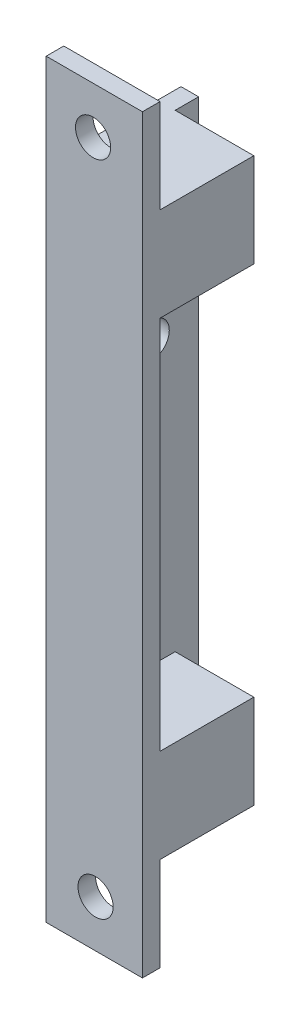
ISO-10303-21;
HEADER;
FILE_DESCRIPTION(('STEP AP214'),'2;1');
FILE_NAME('part.step','',(''),(''),'','','');
FILE_SCHEMA(('AUTOMOTIVE_DESIGN { 1 0 10303 214 1 1 1 1 }'));
ENDSEC;
DATA;
#1=APPLICATION_CONTEXT('core data for automotive mechanical design processes');
#2=APPLICATION_PROTOCOL_DEFINITION('international standard','automotive_design',2000,#1);
#3=PRODUCT_CONTEXT('',#1,'mechanical');
#4=PRODUCT('Part','Part','',(#3));
#5=PRODUCT_RELATED_PRODUCT_CATEGORY('part','',(#4));
#6=PRODUCT_DEFINITION_FORMATION('','',#4);
#7=PRODUCT_DEFINITION_CONTEXT('part definition',#1,'design');
#8=PRODUCT_DEFINITION('design','',#6,#7);
#9=PRODUCT_DEFINITION_SHAPE('','',#8);
#10=(LENGTH_UNIT() NAMED_UNIT(*) SI_UNIT(.MILLI.,.METRE.));
#11=(NAMED_UNIT(*) PLANE_ANGLE_UNIT() SI_UNIT($,.RADIAN.));
#12=(NAMED_UNIT(*) SI_UNIT($,.STERADIAN.) SOLID_ANGLE_UNIT());
#13=UNCERTAINTY_MEASURE_WITH_UNIT(LENGTH_MEASURE(1.E-05),#10,'distance_accuracy_value','');
#14=(GEOMETRIC_REPRESENTATION_CONTEXT(3) GLOBAL_UNCERTAINTY_ASSIGNED_CONTEXT((#13)) GLOBAL_UNIT_ASSIGNED_CONTEXT((#10,
#11,#12)) REPRESENTATION_CONTEXT('',''));
#15=CARTESIAN_POINT('',(0.,0.,0.));
#16=DIRECTION('',(0.,0.,1.));
#17=DIRECTION('',(1.,0.,0.));
#18=AXIS2_PLACEMENT_3D('',#15,#16,#17);
#19=CARTESIAN_POINT('',(0.,0.,0.));
#20=DIRECTION('',(-1.,0.,0.));
#21=DIRECTION('',(0.,0.,1.));
#22=AXIS2_PLACEMENT_3D('',#19,#20,#21);
#23=PLANE('',#22);
#24=CARTESIAN_POINT('',(0.,101.6,-19.05));
#25=DIRECTION('',(1.,0.,0.));
#26=DIRECTION('',(0.,0.,-1.));
#27=AXIS2_PLACEMENT_3D('',#24,#25,#26);
#28=CIRCLE('',#27,4.7625);
#29=CARTESIAN_POINT('',(0.,101.6,-23.8125));
#30=VERTEX_POINT('',#29);
#31=EDGE_CURVE('E247',#30,#30,#28,.T.);
#32=ORIENTED_EDGE('',*,*,#31,.F.);
#33=EDGE_LOOP('',(#32));
#34=FACE_BOUND('',#33,.T.);
#35=DIRECTION('',(0.,0.,1.));
#36=VECTOR('',#35,1.);
#37=CARTESIAN_POINT('',(0.,25.4,-25.4));
#38=LINE('',#37,#36);
#39=CARTESIAN_POINT('',(0.,25.4,-25.4));
#40=VERTEX_POINT('',#39);
#41=CARTESIAN_POINT('',(0.,25.4,0.));
#42=VERTEX_POINT('',#41);
#43=EDGE_CURVE('E230',#40,#42,#38,.T.);
#44=ORIENTED_EDGE('',*,*,#43,.F.);
#45=DIRECTION('',(0.,1.,0.));
#46=VECTOR('',#45,1.);
#47=CARTESIAN_POINT('',(0.,0.,-25.4));
#48=LINE('',#47,#46);
#49=CARTESIAN_POINT('',(0.,0.,-25.4));
#50=VERTEX_POINT('',#49);
#51=EDGE_CURVE('E220',#50,#40,#48,.T.);
#52=ORIENTED_EDGE('',*,*,#51,.F.);
#53=DIRECTION('',(0.,0.,-1.));
#54=VECTOR('',#53,1.);
#55=CARTESIAN_POINT('',(0.,0.,0.));
#56=LINE('',#55,#54);
#57=CARTESIAN_POINT('',(0.,0.,-31.75));
#58=VERTEX_POINT('',#57);
#59=EDGE_CURVE('E241',#50,#58,#56,.T.);
#60=ORIENTED_EDGE('',*,*,#59,.T.);
#61=DIRECTION('',(0.,1.,0.));
#62=VECTOR('',#61,1.);
#63=CARTESIAN_POINT('',(0.,0.,-31.75));
#64=LINE('',#63,#62);
#65=CARTESIAN_POINT('',(0.,152.4,-31.75));
#66=VERTEX_POINT('',#65);
#67=EDGE_CURVE('E244',#58,#66,#64,.T.);
#68=ORIENTED_EDGE('',*,*,#67,.T.);
#69=DIRECTION('',(0.,0.,1.));
#70=VECTOR('',#69,1.);
#71=CARTESIAN_POINT('',(0.,152.4,0.));
#72=LINE('',#71,#70);
#73=CARTESIAN_POINT('',(0.,152.4,-25.4));
#74=VERTEX_POINT('',#73);
#75=EDGE_CURVE('E254',#66,#74,#72,.T.);
#76=ORIENTED_EDGE('',*,*,#75,.T.);
#77=DIRECTION('',(0.,-1.,0.));
#78=VECTOR('',#77,1.);
#79=CARTESIAN_POINT('',(0.,152.4,-25.4));
#80=LINE('',#79,#78);
#81=CARTESIAN_POINT('',(0.,127.,-25.4));
#82=VERTEX_POINT('',#81);
#83=EDGE_CURVE('E211',#74,#82,#80,.T.);
#84=ORIENTED_EDGE('',*,*,#83,.T.);
#85=DIRECTION('',(0.,0.,1.));
#86=VECTOR('',#85,1.);
#87=CARTESIAN_POINT('',(0.,127.,-25.4));
#88=LINE('',#87,#86);
#89=CARTESIAN_POINT('',(0.,127.,0.));
#90=VERTEX_POINT('',#89);
#91=EDGE_CURVE('E200',#82,#90,#88,.T.);
#92=ORIENTED_EDGE('',*,*,#91,.T.);
#93=DIRECTION('',(0.,-1.,0.));
#94=VECTOR('',#93,1.);
#95=CARTESIAN_POINT('',(0.,0.,0.));
#96=LINE('',#95,#94);
#97=EDGE_CURVE('E240',#90,#42,#96,.T.);
#98=ORIENTED_EDGE('',*,*,#97,.T.);
#99=EDGE_LOOP('',(#44,#52,#60,#68,#76,#84,#92,#98));
#100=FACE_BOUND('',#99,.T.);
#101=ADVANCED_FACE('F32',(#34,#100),#23,.F.);
#102=CARTESIAN_POINT('',(0.,0.,0.));
#103=DIRECTION('',(0.,0.,-1.));
#104=DIRECTION('',(-1.,0.,0.));
#105=AXIS2_PLACEMENT_3D('',#102,#103,#104);
#106=PLANE('',#105);
#107=DIRECTION('',(0.,1.,0.));
#108=VECTOR('',#107,1.);
#109=CARTESIAN_POINT('',(21.307884020299,-25.4,0.));
#110=LINE('',#109,#108);
#111=CARTESIAN_POINT('',(21.307884020299,25.4,0.));
#112=VERTEX_POINT('',#111);
#113=CARTESIAN_POINT('',(21.307884020299,127.,0.));
#114=VERTEX_POINT('',#113);
#115=EDGE_CURVE('E162',#112,#114,#110,.T.);
#116=ORIENTED_EDGE('',*,*,#115,.F.);
#117=DIRECTION('',(1.,0.,0.));
#118=VECTOR('',#117,1.);
#119=CARTESIAN_POINT('',(0.,25.4,0.));
#120=LINE('',#119,#118);
#121=EDGE_CURVE('E49',#42,#112,#120,.T.);
#122=ORIENTED_EDGE('',*,*,#121,.F.);
#123=ORIENTED_EDGE('',*,*,#97,.F.);
#124=DIRECTION('',(1.,0.,0.));
#125=VECTOR('',#124,1.);
#126=CARTESIAN_POINT('',(0.,127.,0.));
#127=LINE('',#126,#125);
#128=EDGE_CURVE('E208',#90,#114,#127,.T.);
#129=ORIENTED_EDGE('',*,*,#128,.T.);
#130=EDGE_LOOP('',(#116,#122,#123,#129));
#131=FACE_BOUND('',#130,.T.);
#132=ADVANCED_FACE('F239',(#131),#106,.T.);
#133=CARTESIAN_POINT('',(7.9375,165.1,0.));
#134=DIRECTION('',(0.,0.,1.));
#135=DIRECTION('',(1.,0.,0.));
#136=AXIS2_PLACEMENT_3D('',#133,#134,#135);
#137=CIRCLE('',#136,4.7625);
#138=CARTESIAN_POINT('',(3.175,165.1,0.));
#139=VERTEX_POINT('',#138);
#140=EDGE_CURVE('E187',#139,#139,#137,.T.);
#141=ORIENTED_EDGE('',*,*,#140,.T.);
#142=EDGE_LOOP('',(#141));
#143=FACE_BOUND('',#142,.T.);
#144=CARTESIAN_POINT('',(21.307884020299,152.4,0.));
#145=VERTEX_POINT('',#144);
#146=CARTESIAN_POINT('',(21.307884020299,177.8,0.));
#147=VERTEX_POINT('',#146);
#148=EDGE_CURVE('E164',#145,#147,#110,.T.);
#149=ORIENTED_EDGE('',*,*,#148,.F.);
#150=DIRECTION('',(1.,0.,0.));
#151=VECTOR('',#150,1.);
#152=CARTESIAN_POINT('',(-4.7625,152.4,0.));
#153=LINE('',#152,#151);
#154=CARTESIAN_POINT('',(-4.7625,152.4,0.));
#155=VERTEX_POINT('',#154);
#156=EDGE_CURVE('E11',#155,#145,#153,.T.);
#157=ORIENTED_EDGE('',*,*,#156,.F.);
#158=DIRECTION('',(0.,-1.,0.));
#159=VECTOR('',#158,1.);
#160=CARTESIAN_POINT('',(-4.7625,-25.4,0.));
#161=LINE('',#160,#159);
#162=CARTESIAN_POINT('',(-4.7625,177.8,0.));
#163=VERTEX_POINT('',#162);
#164=EDGE_CURVE('E172',#163,#155,#161,.T.);
#165=ORIENTED_EDGE('',*,*,#164,.F.);
#166=DIRECTION('',(-1.,0.,0.));
#167=VECTOR('',#166,1.);
#168=CARTESIAN_POINT('',(-4.7625,177.8,0.));
#169=LINE('',#168,#167);
#170=EDGE_CURVE('E161',#147,#163,#169,.T.);
#171=ORIENTED_EDGE('',*,*,#170,.F.);
#172=EDGE_LOOP('',(#149,#157,#165,#171));
#173=FACE_BOUND('',#172,.T.);
#174=ADVANCED_FACE('F289',(#143,#173),#106,.T.);
#175=CARTESIAN_POINT('',(-4.7625,152.4,0.));
#176=DIRECTION('',(0.,1.,0.));
#177=DIRECTION('',(0.,0.,1.));
#178=AXIS2_PLACEMENT_3D('',#175,#176,#177);
#179=PLANE('',#178);
#180=ORIENTED_EDGE('',*,*,#75,.F.);
#181=DIRECTION('',(1.,0.,0.));
#182=VECTOR('',#181,1.);
#183=CARTESIAN_POINT('',(-4.7625,152.4,-31.75));
#184=LINE('',#183,#182);
#185=CARTESIAN_POINT('',(-4.7625,152.4,-31.75));
#186=VERTEX_POINT('',#185);
#187=EDGE_CURVE('E41',#186,#66,#184,.T.);
#188=ORIENTED_EDGE('',*,*,#187,.F.);
#189=DIRECTION('',(0.,0.,1.));
#190=VECTOR('',#189,1.);
#191=CARTESIAN_POINT('',(-4.7625,152.4,0.));
#192=LINE('',#191,#190);
#193=EDGE_CURVE('E146',#186,#155,#192,.T.);
#194=ORIENTED_EDGE('',*,*,#193,.T.);
#195=ORIENTED_EDGE('',*,*,#156,.T.);
#196=DIRECTION('',(0.,0.,1.));
#197=VECTOR('',#196,1.);
#198=CARTESIAN_POINT('',(21.307884020299,152.4,-25.4));
#199=LINE('',#198,#197);
#200=CARTESIAN_POINT('',(21.307884020299,152.4,-25.4));
#201=VERTEX_POINT('',#200);
#202=EDGE_CURVE('E197',#201,#145,#199,.T.);
#203=ORIENTED_EDGE('',*,*,#202,.F.);
#204=DIRECTION('',(1.,0.,0.));
#205=VECTOR('',#204,1.);
#206=CARTESIAN_POINT('',(0.,152.4,-25.4));
#207=LINE('',#206,#205);
#208=EDGE_CURVE('E204',#74,#201,#207,.T.);
#209=ORIENTED_EDGE('',*,*,#208,.F.);
#210=EDGE_LOOP('',(#180,#188,#194,#195,#203,#209));
#211=FACE_BOUND('',#210,.T.);
#212=ADVANCED_FACE('F265',(#211),#179,.T.);
#213=CARTESIAN_POINT('',(-4.7625,0.,-31.75));
#214=DIRECTION('',(0.,0.,-1.));
#215=DIRECTION('',(-1.,0.,0.));
#216=AXIS2_PLACEMENT_3D('',#213,#214,#215);
#217=PLANE('',#216);
#218=ORIENTED_EDGE('',*,*,#67,.F.);
#219=DIRECTION('',(1.,0.,0.));
#220=VECTOR('',#219,1.);
#221=CARTESIAN_POINT('',(-4.7625,0.,-31.75));
#222=LINE('',#221,#220);
#223=CARTESIAN_POINT('',(-4.7625,0.,-31.75));
#224=VERTEX_POINT('',#223);
#225=EDGE_CURVE('E145',#224,#58,#222,.T.);
#226=ORIENTED_EDGE('',*,*,#225,.F.);
#227=DIRECTION('',(0.,1.,0.));
#228=VECTOR('',#227,1.);
#229=CARTESIAN_POINT('',(-4.7625,0.,-31.75));
#230=LINE('',#229,#228);
#231=EDGE_CURVE('E314',#224,#186,#230,.T.);
#232=ORIENTED_EDGE('',*,*,#231,.T.);
#233=ORIENTED_EDGE('',*,*,#187,.T.);
#234=EDGE_LOOP('',(#218,#226,#232,#233));
#235=FACE_BOUND('',#234,.T.);
#236=ADVANCED_FACE('F263',(#235),#217,.T.);
#237=CARTESIAN_POINT('',(-4.7625,0.,0.));
#238=DIRECTION('',(0.,-1.,0.));
#239=DIRECTION('',(0.,0.,-1.));
#240=AXIS2_PLACEMENT_3D('',#237,#238,#239);
#241=PLANE('',#240);
#242=ORIENTED_EDGE('',*,*,#59,.F.);
#243=DIRECTION('',(1.,0.,0.));
#244=VECTOR('',#243,1.);
#245=CARTESIAN_POINT('',(0.,0.,-25.4));
#246=LINE('',#245,#244);
#247=CARTESIAN_POINT('',(21.307884020299,0.,-25.4));
#248=VERTEX_POINT('',#247);
#249=EDGE_CURVE('E150',#50,#248,#246,.T.);
#250=ORIENTED_EDGE('',*,*,#249,.T.);
#251=DIRECTION('',(0.,0.,1.));
#252=VECTOR('',#251,1.);
#253=CARTESIAN_POINT('',(21.307884020299,0.,-25.4));
#254=LINE('',#253,#252);
#255=CARTESIAN_POINT('',(21.307884020299,0.,0.));
#256=VERTEX_POINT('',#255);
#257=EDGE_CURVE('E148',#248,#256,#254,.T.);
#258=ORIENTED_EDGE('',*,*,#257,.T.);
#259=DIRECTION('',(1.,0.,0.));
#260=VECTOR('',#259,1.);
#261=CARTESIAN_POINT('',(-4.7625,0.,0.));
#262=LINE('',#261,#260);
#263=CARTESIAN_POINT('',(-4.7625,0.,0.));
#264=VERTEX_POINT('',#263);
#265=EDGE_CURVE('E36',#264,#256,#262,.T.);
#266=ORIENTED_EDGE('',*,*,#265,.F.);
#267=DIRECTION('',(0.,0.,-1.));
#268=VECTOR('',#267,1.);
#269=CARTESIAN_POINT('',(-4.7625,0.,0.));
#270=LINE('',#269,#268);
#271=EDGE_CURVE('E256',#264,#224,#270,.T.);
#272=ORIENTED_EDGE('',*,*,#271,.T.);
#273=ORIENTED_EDGE('',*,*,#225,.T.);
#274=EDGE_LOOP('',(#242,#250,#258,#266,#272,#273));
#275=FACE_BOUND('',#274,.T.);
#276=ADVANCED_FACE('F34',(#275),#241,.T.);
#277=CARTESIAN_POINT('',(-4.7625,0.,0.));
#278=DIRECTION('',(-1.,0.,0.));
#279=DIRECTION('',(0.,0.,1.));
#280=AXIS2_PLACEMENT_3D('',#277,#278,#279);
#281=PLANE('',#280);
#282=CARTESIAN_POINT('',(-4.7625,101.6,-19.05));
#283=DIRECTION('',(1.,0.,0.));
#284=DIRECTION('',(0.,0.,-1.));
#285=AXIS2_PLACEMENT_3D('',#282,#283,#284);
#286=CIRCLE('',#285,4.7625);
#287=CARTESIAN_POINT('',(-4.7625,101.6,-23.8125));
#288=VERTEX_POINT('',#287);
#289=EDGE_CURVE('E242',#288,#288,#286,.T.);
#290=ORIENTED_EDGE('',*,*,#289,.T.);
#291=EDGE_LOOP('',(#290));
#292=FACE_BOUND('',#291,.T.);
#293=ORIENTED_EDGE('',*,*,#271,.F.);
#294=CARTESIAN_POINT('',(-4.7625,-25.4,0.));
#295=VERTEX_POINT('',#294);
#296=EDGE_CURVE('E141',#264,#295,#161,.T.);
#297=ORIENTED_EDGE('',*,*,#296,.T.);
#298=DIRECTION('',(0.,0.,-1.));
#299=VECTOR('',#298,1.);
#300=CARTESIAN_POINT('',(-4.7625,-25.4,4.7625));
#301=LINE('',#300,#299);
#302=CARTESIAN_POINT('',(-4.7625,-25.4,4.7625));
#303=VERTEX_POINT('',#302);
#304=EDGE_CURVE('E318',#303,#295,#301,.T.);
#305=ORIENTED_EDGE('',*,*,#304,.F.);
#306=DIRECTION('',(0.,-1.,0.));
#307=VECTOR('',#306,1.);
#308=CARTESIAN_POINT('',(-4.7625,-25.4,4.7625));
#309=LINE('',#308,#307);
#310=CARTESIAN_POINT('',(-4.7625,177.8,4.7625));
#311=VERTEX_POINT('',#310);
#312=EDGE_CURVE('E165',#311,#303,#309,.T.);
#313=ORIENTED_EDGE('',*,*,#312,.F.);
#314=DIRECTION('',(0.,0.,-1.));
#315=VECTOR('',#314,1.);
#316=CARTESIAN_POINT('',(-4.7625,177.8,4.7625));
#317=LINE('',#316,#315);
#318=EDGE_CURVE('E180',#311,#163,#317,.T.);
#319=ORIENTED_EDGE('',*,*,#318,.T.);
#320=ORIENTED_EDGE('',*,*,#164,.T.);
#321=ORIENTED_EDGE('',*,*,#193,.F.);
#322=ORIENTED_EDGE('',*,*,#231,.F.);
#323=EDGE_LOOP('',(#293,#297,#305,#313,#319,#320,#321,#322));
#324=FACE_BOUND('',#323,.T.);
#325=ADVANCED_FACE('F294',(#292,#324),#281,.T.);
#326=CARTESIAN_POINT('',(-4.7625,101.6,-19.05));
#327=DIRECTION('',(1.,0.,0.));
#328=DIRECTION('',(0.,0.,-1.));
#329=AXIS2_PLACEMENT_3D('',#326,#327,#328);
#330=CYLINDRICAL_SURFACE('',#329,4.7625);
#331=CARTESIAN_POINT('',(-4.7625,101.6,-23.8125));
#332=CARTESIAN_POINT('',(-4.712890625,101.6,-23.8125));
#333=CARTESIAN_POINT('',(-4.66328125,101.6,-23.8125));
#334=CARTESIAN_POINT('',(-4.5640625,101.6,-23.8125));
#335=CARTESIAN_POINT('',(-4.514453125,101.6,-23.8125));
#336=CARTESIAN_POINT('',(-4.415234375,101.6,-23.8125));
#337=CARTESIAN_POINT('',(-4.365625,101.6,-23.8125));
#338=CARTESIAN_POINT('',(-4.26640625,101.6,-23.8125));
#339=CARTESIAN_POINT('',(-4.216796875,101.6,-23.8125));
#340=CARTESIAN_POINT('',(-4.117578125,101.6,-23.8125));
#341=CARTESIAN_POINT('',(-4.06796875,101.6,-23.8125));
#342=CARTESIAN_POINT('',(-3.96875,101.6,-23.8125));
#343=CARTESIAN_POINT('',(-3.919140625,101.6,-23.8125));
#344=CARTESIAN_POINT('',(-3.819921875,101.6,-23.8125));
#345=CARTESIAN_POINT('',(-3.7703125,101.6,-23.8125));
#346=CARTESIAN_POINT('',(-3.67109375,101.6,-23.8125));
#347=CARTESIAN_POINT('',(-3.621484375,101.6,-23.8125));
#348=CARTESIAN_POINT('',(-3.522265625,101.6,-23.8125));
#349=CARTESIAN_POINT('',(-3.47265625,101.6,-23.8125));
#350=CARTESIAN_POINT('',(-3.3734375,101.6,-23.8125));
#351=CARTESIAN_POINT('',(-3.323828125,101.6,-23.8125));
#352=CARTESIAN_POINT('',(-3.224609375,101.6,-23.8125));
#353=CARTESIAN_POINT('',(-3.175,101.6,-23.8125));
#354=CARTESIAN_POINT('',(-3.07578125,101.6,-23.8125));
#355=CARTESIAN_POINT('',(-3.026171875,101.6,-23.8125));
#356=CARTESIAN_POINT('',(-2.926953125,101.6,-23.8125));
#357=CARTESIAN_POINT('',(-2.87734375,101.6,-23.8125));
#358=CARTESIAN_POINT('',(-2.778125,101.6,-23.8125));
#359=CARTESIAN_POINT('',(-2.728515625,101.6,-23.8125));
#360=CARTESIAN_POINT('',(-2.629296875,101.6,-23.8125));
#361=CARTESIAN_POINT('',(-2.5796875,101.6,-23.8125));
#362=CARTESIAN_POINT('',(-2.48046875,101.6,-23.8125));
#363=CARTESIAN_POINT('',(-2.430859375,101.6,-23.8125));
#364=CARTESIAN_POINT('',(-2.331640625,101.6,-23.8125));
#365=CARTESIAN_POINT('',(-2.28203125,101.6,-23.8125));
#366=CARTESIAN_POINT('',(-2.1828125,101.6,-23.8125));
#367=CARTESIAN_POINT('',(-2.133203125,101.6,-23.8125));
#368=CARTESIAN_POINT('',(-2.033984375,101.6,-23.8125));
#369=CARTESIAN_POINT('',(-1.984375,101.6,-23.8125));
#370=CARTESIAN_POINT('',(-1.88515625,101.6,-23.8125));
#371=CARTESIAN_POINT('',(-1.835546875,101.6,-23.8125));
#372=CARTESIAN_POINT('',(-1.736328125,101.6,-23.8125));
#373=CARTESIAN_POINT('',(-1.68671875,101.6,-23.8125));
#374=CARTESIAN_POINT('',(-1.5875,101.6,-23.8125));
#375=CARTESIAN_POINT('',(-1.537890625,101.6,-23.8125));
#376=CARTESIAN_POINT('',(-1.438671875,101.6,-23.8125));
#377=CARTESIAN_POINT('',(-1.3890625,101.6,-23.8125));
#378=CARTESIAN_POINT('',(-1.28984375,101.6,-23.8125));
#379=CARTESIAN_POINT('',(-1.240234375,101.6,-23.8125));
#380=CARTESIAN_POINT('',(-1.141015625,101.6,-23.8125));
#381=CARTESIAN_POINT('',(-1.09140625,101.6,-23.8125));
#382=CARTESIAN_POINT('',(-0.9921875,101.6,-23.8125));
#383=CARTESIAN_POINT('',(-0.942578125,101.6,-23.8125));
#384=CARTESIAN_POINT('',(-0.843359375,101.6,-23.8125));
#385=CARTESIAN_POINT('',(-0.79375,101.6,-23.8125));
#386=CARTESIAN_POINT('',(-0.69453125,101.6,-23.8125));
#387=CARTESIAN_POINT('',(-0.644921875,101.6,-23.8125));
#388=CARTESIAN_POINT('',(-0.545703125,101.6,-23.8125));
#389=CARTESIAN_POINT('',(-0.49609375,101.6,-23.8125));
#390=CARTESIAN_POINT('',(-0.396875,101.6,-23.8125));
#391=CARTESIAN_POINT('',(-0.347265625,101.6,-23.8125));
#392=CARTESIAN_POINT('',(-0.248046875,101.6,-23.8125));
#393=CARTESIAN_POINT('',(-0.1984375,101.6,-23.8125));
#394=CARTESIAN_POINT('',(-0.09921875,101.6,-23.8125));
#395=CARTESIAN_POINT('',(-0.049609375,101.6,-23.8125));
#396=CARTESIAN_POINT('',(0.,101.6,-23.8125));
#397=B_SPLINE_CURVE_WITH_KNOTS('',3,(#331,#332,#333,#334,#335,#336,#337,#338,#339,#340,#341,
#342,#343,#344,#345,#346,#347,#348,#349,#350,#351,#352,#353,#354,#355,#356,#357,#358,#359,#360,
#361,#362,#363,#364,#365,#366,#367,#368,#369,#370,#371,#372,#373,#374,#375,#376,#377,#378,#379,
#380,#381,#382,#383,#384,#385,#386,#387,#388,#389,#390,#391,#392,#393,#394,#395,#396),
.UNSPECIFIED.,.F.,.F.,(4,2,2,2,2,2,2,2,2,2,2,2,2,2,2,2,2,2,2,2,2,2,2,2,2,2,2,2,2,2,2,2,4),(0.,
0.148828125,0.29765625,0.446484375,0.5953125,0.744140625,0.892968750000001,1.041796875,1.190625,
1.339453125,1.48828125,1.637109375,1.7859375,1.934765625,2.08359375,2.232421875,2.38125,
2.530078125,2.67890625,2.827734375,2.9765625,3.125390625,3.27421875,3.423046875,3.571875,
3.720703125,3.86953125,4.018359375,4.1671875,4.316015625,4.46484375,4.613671875,4.7625),.UNSPECIFIED.);
#398=EDGE_CURVE('BSEAM304',#288,#30,#397,.T.);
#399=ORIENTED_EDGE('',*,*,#289,.F.);
#400=ORIENTED_EDGE('',*,*,#31,.T.);
#401=ORIENTED_EDGE('',*,*,#398,.T.);
#402=ORIENTED_EDGE('',*,*,#398,.F.);
#403=EDGE_LOOP('',(#399,#401,#400,#402));
#404=FACE_BOUND('',#403,.T.);
#405=ADVANCED_FACE('F304',(#404),#330,.F.);
#406=ORIENTED_EDGE('',*,*,#265,.T.);
#407=CARTESIAN_POINT('',(21.307884020299,-25.4,0.));
#408=VERTEX_POINT('',#407);
#409=EDGE_CURVE('E140',#408,#256,#110,.T.);
#410=ORIENTED_EDGE('',*,*,#409,.F.);
#411=DIRECTION('',(1.,0.,0.));
#412=VECTOR('',#411,1.);
#413=CARTESIAN_POINT('',(-4.7625,-25.4,0.));
#414=LINE('',#413,#412);
#415=EDGE_CURVE('E168',#295,#408,#414,.T.);
#416=ORIENTED_EDGE('',*,*,#415,.F.);
#417=ORIENTED_EDGE('',*,*,#296,.F.);
#418=EDGE_LOOP('',(#406,#410,#416,#417));
#419=FACE_BOUND('',#418,.T.);
#420=CARTESIAN_POINT('',(8.60788402029904,-12.7,0.));
#421=DIRECTION('',(0.,0.,1.));
#422=DIRECTION('',(1.,0.,0.));
#423=AXIS2_PLACEMENT_3D('',#420,#421,#422);
#424=CIRCLE('',#423,4.7625);
#425=CARTESIAN_POINT('',(3.84538402029904,-12.7,0.));
#426=VERTEX_POINT('',#425);
#427=EDGE_CURVE('E194',#426,#426,#424,.T.);
#428=ORIENTED_EDGE('',*,*,#427,.T.);
#429=EDGE_LOOP('',(#428));
#430=FACE_BOUND('',#429,.T.);
#431=ADVANCED_FACE('F136',(#419,#430),#106,.T.);
#432=CARTESIAN_POINT('',(0.,0.,4.7625));
#433=DIRECTION('',(0.,0.,-1.));
#434=DIRECTION('',(-1.,0.,0.));
#435=AXIS2_PLACEMENT_3D('',#432,#433,#434);
#436=PLANE('',#435);
#437=ORIENTED_EDGE('',*,*,#312,.T.);
#438=DIRECTION('',(1.,0.,0.));
#439=VECTOR('',#438,1.);
#440=CARTESIAN_POINT('',(-4.7625,-25.4,4.7625));
#441=LINE('',#440,#439);
#442=CARTESIAN_POINT('',(21.307884020299,-25.4,4.7625));
#443=VERTEX_POINT('',#442);
#444=EDGE_CURVE('E183',#303,#443,#441,.T.);
#445=ORIENTED_EDGE('',*,*,#444,.T.);
#446=DIRECTION('',(0.,1.,0.));
#447=VECTOR('',#446,1.);
#448=CARTESIAN_POINT('',(21.307884020299,-25.4,4.7625));
#449=LINE('',#448,#447);
#450=CARTESIAN_POINT('',(21.307884020299,177.8,4.7625));
#451=VERTEX_POINT('',#450);
#452=EDGE_CURVE('E181',#443,#451,#449,.T.);
#453=ORIENTED_EDGE('',*,*,#452,.T.);
#454=DIRECTION('',(-1.,0.,0.));
#455=VECTOR('',#454,1.);
#456=CARTESIAN_POINT('',(-4.7625,177.8,4.7625));
#457=LINE('',#456,#455);
#458=EDGE_CURVE('E178',#451,#311,#457,.T.);
#459=ORIENTED_EDGE('',*,*,#458,.T.);
#460=EDGE_LOOP('',(#437,#445,#453,#459));
#461=FACE_BOUND('',#460,.T.);
#462=CARTESIAN_POINT('',(7.9375,165.1,4.7625));
#463=DIRECTION('',(0.,0.,1.));
#464=DIRECTION('',(1.,0.,0.));
#465=AXIS2_PLACEMENT_3D('',#462,#463,#464);
#466=CIRCLE('',#465,4.7625);
#467=CARTESIAN_POINT('',(3.175,165.1,4.7625));
#468=VERTEX_POINT('',#467);
#469=EDGE_CURVE('E190',#468,#468,#466,.T.);
#470=ORIENTED_EDGE('',*,*,#469,.F.);
#471=EDGE_LOOP('',(#470));
#472=FACE_BOUND('',#471,.T.);
#473=CARTESIAN_POINT('',(8.60788402029904,-12.7,4.7625));
#474=DIRECTION('',(0.,0.,1.));
#475=DIRECTION('',(1.,0.,0.));
#476=AXIS2_PLACEMENT_3D('',#473,#474,#475);
#477=CIRCLE('',#476,4.7625);
#478=CARTESIAN_POINT('',(3.84538402029904,-12.7,4.7625));
#479=VERTEX_POINT('',#478);
#480=EDGE_CURVE('E191',#479,#479,#477,.T.);
#481=ORIENTED_EDGE('',*,*,#480,.F.);
#482=EDGE_LOOP('',(#481));
#483=FACE_BOUND('',#482,.T.);
#484=ADVANCED_FACE('F334',(#461,#472,#483),#436,.F.);
#485=CARTESIAN_POINT('',(-4.7625,-25.4,4.7625));
#486=DIRECTION('',(0.,1.,0.));
#487=DIRECTION('',(0.,0.,1.));
#488=AXIS2_PLACEMENT_3D('',#485,#486,#487);
#489=PLANE('',#488);
#490=ORIENTED_EDGE('',*,*,#415,.T.);
#491=DIRECTION('',(0.,0.,-1.));
#492=VECTOR('',#491,1.);
#493=CARTESIAN_POINT('',(21.307884020299,-25.4,4.7625));
#494=LINE('',#493,#492);
#495=EDGE_CURVE('E160',#443,#408,#494,.T.);
#496=ORIENTED_EDGE('',*,*,#495,.F.);
#497=ORIENTED_EDGE('',*,*,#444,.F.);
#498=ORIENTED_EDGE('',*,*,#304,.T.);
#499=EDGE_LOOP('',(#490,#496,#497,#498));
#500=FACE_BOUND('',#499,.T.);
#501=ADVANCED_FACE('F336',(#500),#489,.F.);
#502=CARTESIAN_POINT('',(21.307884020299,-25.4,4.7625));
#503=DIRECTION('',(-1.,0.,0.));
#504=DIRECTION('',(0.,0.,1.));
#505=AXIS2_PLACEMENT_3D('',#502,#503,#504);
#506=PLANE('',#505);
#507=ORIENTED_EDGE('',*,*,#409,.T.);
#508=ORIENTED_EDGE('',*,*,#257,.F.);
#509=DIRECTION('',(0.,1.,0.));
#510=VECTOR('',#509,1.);
#511=CARTESIAN_POINT('',(21.307884020299,0.,-25.4));
#512=LINE('',#511,#510);
#513=CARTESIAN_POINT('',(21.307884020299,25.4,-25.4));
#514=VERTEX_POINT('',#513);
#515=EDGE_CURVE('E225',#248,#514,#512,.T.);
#516=ORIENTED_EDGE('',*,*,#515,.T.);
#517=DIRECTION('',(0.,0.,1.));
#518=VECTOR('',#517,1.);
#519=CARTESIAN_POINT('',(21.307884020299,25.4,-25.4));
#520=LINE('',#519,#518);
#521=EDGE_CURVE('E154',#514,#112,#520,.T.);
#522=ORIENTED_EDGE('',*,*,#521,.T.);
#523=ORIENTED_EDGE('',*,*,#115,.T.);
#524=DIRECTION('',(0.,0.,1.));
#525=VECTOR('',#524,1.);
#526=CARTESIAN_POINT('',(21.307884020299,127.,-25.4));
#527=LINE('',#526,#525);
#528=CARTESIAN_POINT('',(21.307884020299,127.,-25.4));
#529=VERTEX_POINT('',#528);
#530=EDGE_CURVE('E203',#529,#114,#527,.T.);
#531=ORIENTED_EDGE('',*,*,#530,.F.);
#532=DIRECTION('',(0.,-1.,0.));
#533=VECTOR('',#532,1.);
#534=CARTESIAN_POINT('',(21.307884020299,152.4,-25.4));
#535=LINE('',#534,#533);
#536=EDGE_CURVE('E213',#201,#529,#535,.T.);
#537=ORIENTED_EDGE('',*,*,#536,.F.);
#538=ORIENTED_EDGE('',*,*,#202,.T.);
#539=ORIENTED_EDGE('',*,*,#148,.T.);
#540=DIRECTION('',(0.,0.,-1.));
#541=VECTOR('',#540,1.);
#542=CARTESIAN_POINT('',(21.307884020299,177.8,4.7625));
#543=LINE('',#542,#541);
#544=EDGE_CURVE('E322',#451,#147,#543,.T.);
#545=ORIENTED_EDGE('',*,*,#544,.F.);
#546=ORIENTED_EDGE('',*,*,#452,.F.);
#547=ORIENTED_EDGE('',*,*,#495,.T.);
#548=EDGE_LOOP('',(#507,#508,#516,#522,#523,#531,#537,#538,#539,#545,#546,#547));
#549=FACE_BOUND('',#548,.T.);
#550=ADVANCED_FACE('F157',(#549),#506,.F.);
#551=CARTESIAN_POINT('',(-4.7625,177.8,4.7625));
#552=DIRECTION('',(0.,-1.,0.));
#553=DIRECTION('',(0.,0.,-1.));
#554=AXIS2_PLACEMENT_3D('',#551,#552,#553);
#555=PLANE('',#554);
#556=ORIENTED_EDGE('',*,*,#170,.T.);
#557=ORIENTED_EDGE('',*,*,#318,.F.);
#558=ORIENTED_EDGE('',*,*,#458,.F.);
#559=ORIENTED_EDGE('',*,*,#544,.T.);
#560=EDGE_LOOP('',(#556,#557,#558,#559));
#561=FACE_BOUND('',#560,.T.);
#562=ADVANCED_FACE('F332',(#561),#555,.F.);
#563=CARTESIAN_POINT('',(7.9375,165.1,4.7625));
#564=DIRECTION('',(0.,0.,-1.));
#565=DIRECTION('',(-1.,0.,0.));
#566=AXIS2_PLACEMENT_3D('',#563,#564,#565);
#567=CYLINDRICAL_SURFACE('',#566,4.7625);
#568=CARTESIAN_POINT('',(3.175,165.1,4.7625));
#569=CARTESIAN_POINT('',(3.175,165.1,4.712890625));
#570=CARTESIAN_POINT('',(3.175,165.1,4.66328125));
#571=CARTESIAN_POINT('',(3.175,165.1,4.5640625));
#572=CARTESIAN_POINT('',(3.175,165.1,4.514453125));
#573=CARTESIAN_POINT('',(3.175,165.1,4.415234375));
#574=CARTESIAN_POINT('',(3.175,165.1,4.365625));
#575=CARTESIAN_POINT('',(3.175,165.1,4.26640625));
#576=CARTESIAN_POINT('',(3.175,165.1,4.216796875));
#577=CARTESIAN_POINT('',(3.175,165.1,4.117578125));
#578=CARTESIAN_POINT('',(3.175,165.1,4.06796875));
#579=CARTESIAN_POINT('',(3.175,165.1,3.96875));
#580=CARTESIAN_POINT('',(3.175,165.1,3.919140625));
#581=CARTESIAN_POINT('',(3.175,165.1,3.819921875));
#582=CARTESIAN_POINT('',(3.175,165.1,3.7703125));
#583=CARTESIAN_POINT('',(3.175,165.1,3.67109375));
#584=CARTESIAN_POINT('',(3.175,165.1,3.621484375));
#585=CARTESIAN_POINT('',(3.175,165.1,3.522265625));
#586=CARTESIAN_POINT('',(3.175,165.1,3.47265625));
#587=CARTESIAN_POINT('',(3.175,165.1,3.3734375));
#588=CARTESIAN_POINT('',(3.175,165.1,3.323828125));
#589=CARTESIAN_POINT('',(3.175,165.1,3.224609375));
#590=CARTESIAN_POINT('',(3.175,165.1,3.175));
#591=CARTESIAN_POINT('',(3.175,165.1,3.07578125));
#592=CARTESIAN_POINT('',(3.175,165.1,3.026171875));
#593=CARTESIAN_POINT('',(3.175,165.1,2.926953125));
#594=CARTESIAN_POINT('',(3.175,165.1,2.87734375));
#595=CARTESIAN_POINT('',(3.175,165.1,2.778125));
#596=CARTESIAN_POINT('',(3.175,165.1,2.728515625));
#597=CARTESIAN_POINT('',(3.175,165.1,2.629296875));
#598=CARTESIAN_POINT('',(3.175,165.1,2.5796875));
#599=CARTESIAN_POINT('',(3.175,165.1,2.48046875));
#600=CARTESIAN_POINT('',(3.175,165.1,2.430859375));
#601=CARTESIAN_POINT('',(3.175,165.1,2.331640625));
#602=CARTESIAN_POINT('',(3.175,165.1,2.28203125));
#603=CARTESIAN_POINT('',(3.175,165.1,2.1828125));
#604=CARTESIAN_POINT('',(3.175,165.1,2.133203125));
#605=CARTESIAN_POINT('',(3.175,165.1,2.033984375));
#606=CARTESIAN_POINT('',(3.175,165.1,1.984375));
#607=CARTESIAN_POINT('',(3.175,165.1,1.88515625));
#608=CARTESIAN_POINT('',(3.175,165.1,1.835546875));
#609=CARTESIAN_POINT('',(3.175,165.1,1.736328125));
#610=CARTESIAN_POINT('',(3.175,165.1,1.68671875));
#611=CARTESIAN_POINT('',(3.175,165.1,1.5875));
#612=CARTESIAN_POINT('',(3.175,165.1,1.537890625));
#613=CARTESIAN_POINT('',(3.175,165.1,1.438671875));
#614=CARTESIAN_POINT('',(3.175,165.1,1.3890625));
#615=CARTESIAN_POINT('',(3.175,165.1,1.28984375));
#616=CARTESIAN_POINT('',(3.175,165.1,1.240234375));
#617=CARTESIAN_POINT('',(3.175,165.1,1.141015625));
#618=CARTESIAN_POINT('',(3.175,165.1,1.09140625));
#619=CARTESIAN_POINT('',(3.175,165.1,0.992187499999999));
#620=CARTESIAN_POINT('',(3.175,165.1,0.942578124999999));
#621=CARTESIAN_POINT('',(3.175,165.1,0.843359375));
#622=CARTESIAN_POINT('',(3.175,165.1,0.79375));
#623=CARTESIAN_POINT('',(3.175,165.1,0.69453125));
#624=CARTESIAN_POINT('',(3.175,165.1,0.644921875));
#625=CARTESIAN_POINT('',(3.175,165.1,0.545703125));
#626=CARTESIAN_POINT('',(3.175,165.1,0.49609375));
#627=CARTESIAN_POINT('',(3.175,165.1,0.396875));
#628=CARTESIAN_POINT('',(3.175,165.1,0.347265625));
#629=CARTESIAN_POINT('',(3.175,165.1,0.248046875));
#630=CARTESIAN_POINT('',(3.175,165.1,0.1984375));
#631=CARTESIAN_POINT('',(3.175,165.1,0.09921875));
#632=CARTESIAN_POINT('',(3.175,165.1,0.049609375));
#633=CARTESIAN_POINT('',(3.175,165.1,0.));
#634=B_SPLINE_CURVE_WITH_KNOTS('',3,(#568,#569,#570,#571,#572,#573,#574,#575,#576,#577,#578,
#579,#580,#581,#582,#583,#584,#585,#586,#587,#588,#589,#590,#591,#592,#593,#594,#595,#596,#597,
#598,#599,#600,#601,#602,#603,#604,#605,#606,#607,#608,#609,#610,#611,#612,#613,#614,#615,#616,
#617,#618,#619,#620,#621,#622,#623,#624,#625,#626,#627,#628,#629,#630,#631,#632,#633),
.UNSPECIFIED.,.F.,.F.,(4,2,2,2,2,2,2,2,2,2,2,2,2,2,2,2,2,2,2,2,2,2,2,2,2,2,2,2,2,2,2,2,4),(0.,
0.148828125,0.29765625,0.446484375,0.5953125,0.744140625,0.892968750000001,1.041796875,1.190625,
1.339453125,1.48828125,1.637109375,1.7859375,1.934765625,2.08359375,2.232421875,2.38125,
2.530078125,2.67890625,2.827734375,2.9765625,3.125390625,3.27421875,3.423046875,3.571875,
3.720703125,3.86953125,4.018359375,4.1671875,4.316015625,4.46484375,4.613671875,4.7625),.UNSPECIFIED.);
#635=EDGE_CURVE('BSEAM347',#468,#139,#634,.T.);
#636=ORIENTED_EDGE('',*,*,#469,.T.);
#637=ORIENTED_EDGE('',*,*,#140,.F.);
#638=ORIENTED_EDGE('',*,*,#635,.T.);
#639=ORIENTED_EDGE('',*,*,#635,.F.);
#640=EDGE_LOOP('',(#636,#638,#637,#639));
#641=FACE_BOUND('',#640,.T.);
#642=ADVANCED_FACE('F347',(#641),#567,.F.);
#643=CARTESIAN_POINT('',(8.60788402029904,-12.7,4.7625));
#644=DIRECTION('',(0.,0.,-1.));
#645=DIRECTION('',(-1.,0.,0.));
#646=AXIS2_PLACEMENT_3D('',#643,#644,#645);
#647=CYLINDRICAL_SURFACE('',#646,4.7625);
#648=CARTESIAN_POINT('',(3.84538402029904,-12.7,4.7625));
#649=CARTESIAN_POINT('',(3.84538402029904,-12.7,4.712890625));
#650=CARTESIAN_POINT('',(3.84538402029904,-12.7,4.66328125));
#651=CARTESIAN_POINT('',(3.84538402029904,-12.7,4.5640625));
#652=CARTESIAN_POINT('',(3.84538402029904,-12.7,4.514453125));
#653=CARTESIAN_POINT('',(3.84538402029904,-12.7,4.415234375));
#654=CARTESIAN_POINT('',(3.84538402029904,-12.7,4.365625));
#655=CARTESIAN_POINT('',(3.84538402029904,-12.7,4.26640625));
#656=CARTESIAN_POINT('',(3.84538402029904,-12.7,4.216796875));
#657=CARTESIAN_POINT('',(3.84538402029904,-12.7,4.117578125));
#658=CARTESIAN_POINT('',(3.84538402029904,-12.7,4.06796875));
#659=CARTESIAN_POINT('',(3.84538402029904,-12.7,3.96875));
#660=CARTESIAN_POINT('',(3.84538402029904,-12.7,3.919140625));
#661=CARTESIAN_POINT('',(3.84538402029904,-12.7,3.819921875));
#662=CARTESIAN_POINT('',(3.84538402029904,-12.7,3.7703125));
#663=CARTESIAN_POINT('',(3.84538402029904,-12.7,3.67109375));
#664=CARTESIAN_POINT('',(3.84538402029904,-12.7,3.621484375));
#665=CARTESIAN_POINT('',(3.84538402029904,-12.7,3.522265625));
#666=CARTESIAN_POINT('',(3.84538402029904,-12.7,3.47265625));
#667=CARTESIAN_POINT('',(3.84538402029904,-12.7,3.3734375));
#668=CARTESIAN_POINT('',(3.84538402029904,-12.7,3.323828125));
#669=CARTESIAN_POINT('',(3.84538402029904,-12.7,3.224609375));
#670=CARTESIAN_POINT('',(3.84538402029904,-12.7,3.175));
#671=CARTESIAN_POINT('',(3.84538402029904,-12.7,3.07578125));
#672=CARTESIAN_POINT('',(3.84538402029904,-12.7,3.026171875));
#673=CARTESIAN_POINT('',(3.84538402029904,-12.7,2.926953125));
#674=CARTESIAN_POINT('',(3.84538402029904,-12.7,2.87734375));
#675=CARTESIAN_POINT('',(3.84538402029904,-12.7,2.778125));
#676=CARTESIAN_POINT('',(3.84538402029904,-12.7,2.728515625));
#677=CARTESIAN_POINT('',(3.84538402029904,-12.7,2.629296875));
#678=CARTESIAN_POINT('',(3.84538402029904,-12.7,2.5796875));
#679=CARTESIAN_POINT('',(3.84538402029904,-12.7,2.48046875));
#680=CARTESIAN_POINT('',(3.84538402029904,-12.7,2.430859375));
#681=CARTESIAN_POINT('',(3.84538402029904,-12.7,2.331640625));
#682=CARTESIAN_POINT('',(3.84538402029904,-12.7,2.28203125));
#683=CARTESIAN_POINT('',(3.84538402029904,-12.7,2.1828125));
#684=CARTESIAN_POINT('',(3.84538402029904,-12.7,2.133203125));
#685=CARTESIAN_POINT('',(3.84538402029904,-12.7,2.033984375));
#686=CARTESIAN_POINT('',(3.84538402029904,-12.7,1.984375));
#687=CARTESIAN_POINT('',(3.84538402029904,-12.7,1.88515625));
#688=CARTESIAN_POINT('',(3.84538402029904,-12.7,1.835546875));
#689=CARTESIAN_POINT('',(3.84538402029904,-12.7,1.736328125));
#690=CARTESIAN_POINT('',(3.84538402029904,-12.7,1.68671875));
#691=CARTESIAN_POINT('',(3.84538402029904,-12.7,1.5875));
#692=CARTESIAN_POINT('',(3.84538402029904,-12.7,1.537890625));
#693=CARTESIAN_POINT('',(3.84538402029904,-12.7,1.438671875));
#694=CARTESIAN_POINT('',(3.84538402029904,-12.7,1.3890625));
#695=CARTESIAN_POINT('',(3.84538402029904,-12.7,1.28984375));
#696=CARTESIAN_POINT('',(3.84538402029904,-12.7,1.240234375));
#697=CARTESIAN_POINT('',(3.84538402029904,-12.7,1.141015625));
#698=CARTESIAN_POINT('',(3.84538402029904,-12.7,1.09140625));
#699=CARTESIAN_POINT('',(3.84538402029904,-12.7,0.992187499999999));
#700=CARTESIAN_POINT('',(3.84538402029904,-12.7,0.942578124999999));
#701=CARTESIAN_POINT('',(3.84538402029904,-12.7,0.843359375));
#702=CARTESIAN_POINT('',(3.84538402029904,-12.7,0.79375));
#703=CARTESIAN_POINT('',(3.84538402029904,-12.7,0.69453125));
#704=CARTESIAN_POINT('',(3.84538402029904,-12.7,0.644921875));
#705=CARTESIAN_POINT('',(3.84538402029904,-12.7,0.545703125));
#706=CARTESIAN_POINT('',(3.84538402029904,-12.7,0.49609375));
#707=CARTESIAN_POINT('',(3.84538402029904,-12.7,0.396875));
#708=CARTESIAN_POINT('',(3.84538402029904,-12.7,0.347265625));
#709=CARTESIAN_POINT('',(3.84538402029904,-12.7,0.248046875));
#710=CARTESIAN_POINT('',(3.84538402029904,-12.7,0.1984375));
#711=CARTESIAN_POINT('',(3.84538402029904,-12.7,0.09921875));
#712=CARTESIAN_POINT('',(3.84538402029904,-12.7,0.049609375));
#713=CARTESIAN_POINT('',(3.84538402029904,-12.7,0.));
#714=B_SPLINE_CURVE_WITH_KNOTS('',3,(#648,#649,#650,#651,#652,#653,#654,#655,#656,#657,#658,
#659,#660,#661,#662,#663,#664,#665,#666,#667,#668,#669,#670,#671,#672,#673,#674,#675,#676,#677,
#678,#679,#680,#681,#682,#683,#684,#685,#686,#687,#688,#689,#690,#691,#692,#693,#694,#695,#696,
#697,#698,#699,#700,#701,#702,#703,#704,#705,#706,#707,#708,#709,#710,#711,#712,#713),
.UNSPECIFIED.,.F.,.F.,(4,2,2,2,2,2,2,2,2,2,2,2,2,2,2,2,2,2,2,2,2,2,2,2,2,2,2,2,2,2,2,2,4),(0.,
0.148828125,0.29765625,0.446484375,0.5953125,0.744140625,0.892968750000001,1.041796875,1.190625,
1.339453125,1.48828125,1.637109375,1.7859375,1.934765625,2.08359375,2.232421875,2.38125,
2.530078125,2.67890625,2.827734375,2.9765625,3.125390625,3.27421875,3.423046875,3.571875,
3.720703125,3.86953125,4.018359375,4.1671875,4.316015625,4.46484375,4.613671875,4.7625),.UNSPECIFIED.);
#715=EDGE_CURVE('BSEAM352',#479,#426,#714,.T.);
#716=ORIENTED_EDGE('',*,*,#480,.T.);
#717=ORIENTED_EDGE('',*,*,#427,.F.);
#718=ORIENTED_EDGE('',*,*,#715,.T.);
#719=ORIENTED_EDGE('',*,*,#715,.F.);
#720=EDGE_LOOP('',(#716,#718,#717,#719));
#721=FACE_BOUND('',#720,.T.);
#722=ADVANCED_FACE('F352',(#721),#647,.F.);
#723=CARTESIAN_POINT('',(0.,127.,-25.4));
#724=DIRECTION('',(0.,-1.,0.));
#725=DIRECTION('',(0.,0.,-1.));
#726=AXIS2_PLACEMENT_3D('',#723,#724,#725);
#727=PLANE('',#726);
#728=ORIENTED_EDGE('',*,*,#128,.F.);
#729=ORIENTED_EDGE('',*,*,#91,.F.);
#730=DIRECTION('',(1.,0.,0.));
#731=VECTOR('',#730,1.);
#732=CARTESIAN_POINT('',(0.,127.,-25.4));
#733=LINE('',#732,#731);
#734=EDGE_CURVE('E215',#82,#529,#733,.T.);
#735=ORIENTED_EDGE('',*,*,#734,.T.);
#736=ORIENTED_EDGE('',*,*,#530,.T.);
#737=EDGE_LOOP('',(#728,#729,#735,#736));
#738=FACE_BOUND('',#737,.T.);
#739=ADVANCED_FACE('F273',(#738),#727,.T.);
#740=CARTESIAN_POINT('',(0.,0.,-25.4));
#741=DIRECTION('',(0.,0.,1.));
#742=DIRECTION('',(1.,0.,0.));
#743=AXIS2_PLACEMENT_3D('',#740,#741,#742);
#744=PLANE('',#743);
#745=ORIENTED_EDGE('',*,*,#83,.F.);
#746=ORIENTED_EDGE('',*,*,#208,.T.);
#747=ORIENTED_EDGE('',*,*,#536,.T.);
#748=ORIENTED_EDGE('',*,*,#734,.F.);
#749=EDGE_LOOP('',(#745,#746,#747,#748));
#750=FACE_BOUND('',#749,.T.);
#751=ADVANCED_FACE('F270',(#750),#744,.F.);
#752=CARTESIAN_POINT('',(0.,25.4,-25.4));
#753=DIRECTION('',(0.,-1.,0.));
#754=DIRECTION('',(0.,0.,-1.));
#755=AXIS2_PLACEMENT_3D('',#752,#753,#754);
#756=PLANE('',#755);
#757=ORIENTED_EDGE('',*,*,#121,.T.);
#758=ORIENTED_EDGE('',*,*,#521,.F.);
#759=DIRECTION('',(1.,0.,0.));
#760=VECTOR('',#759,1.);
#761=CARTESIAN_POINT('',(0.,25.4,-25.4));
#762=LINE('',#761,#760);
#763=EDGE_CURVE('E223',#40,#514,#762,.T.);
#764=ORIENTED_EDGE('',*,*,#763,.F.);
#765=ORIENTED_EDGE('',*,*,#43,.T.);
#766=EDGE_LOOP('',(#757,#758,#764,#765));
#767=FACE_BOUND('',#766,.T.);
#768=ADVANCED_FACE('F232',(#767),#756,.F.);
#769=CARTESIAN_POINT('',(0.,0.,-25.4));
#770=DIRECTION('',(0.,0.,-1.));
#771=DIRECTION('',(-1.,0.,0.));
#772=AXIS2_PLACEMENT_3D('',#769,#770,#771);
#773=PLANE('',#772);
#774=ORIENTED_EDGE('',*,*,#51,.T.);
#775=ORIENTED_EDGE('',*,*,#763,.T.);
#776=ORIENTED_EDGE('',*,*,#515,.F.);
#777=ORIENTED_EDGE('',*,*,#249,.F.);
#778=EDGE_LOOP('',(#774,#775,#776,#777));
#779=FACE_BOUND('',#778,.T.);
#780=ADVANCED_FACE('F275',(#779),#773,.T.);
#781=CLOSED_SHELL('',(#101,#132,#174,#212,#236,#276,#325,#405,#431,#484,#501,#550,#562,#642,
#722,#739,#751,#768,#780));
#782=MANIFOLD_SOLID_BREP('B2',#781);
#783=ADVANCED_BREP_SHAPE_REPRESENTATION('',(#18,#782),#14);
#784=SHAPE_DEFINITION_REPRESENTATION(#9,#783);
ENDSEC;
END-ISO-10303-21;
